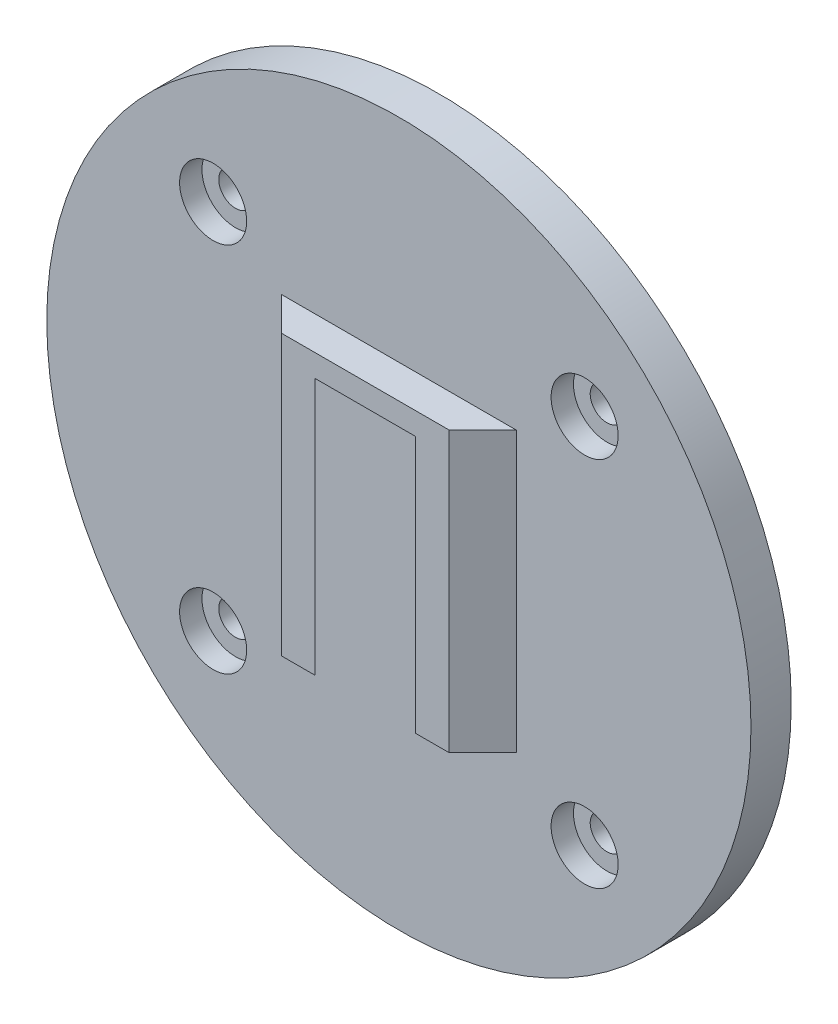
ISO-10303-21;
HEADER;
FILE_DESCRIPTION(('STEP AP214'),'2;1');
FILE_NAME('part.step','',(''),(''),'','','');
FILE_SCHEMA(('AUTOMOTIVE_DESIGN { 1 0 10303 214 1 1 1 1 }'));
ENDSEC;
DATA;
#1=APPLICATION_CONTEXT('core data for automotive mechanical design processes');
#2=APPLICATION_PROTOCOL_DEFINITION('international standard','automotive_design',2000,#1);
#3=PRODUCT_CONTEXT('',#1,'mechanical');
#4=PRODUCT('Part','Part','',(#3));
#5=PRODUCT_RELATED_PRODUCT_CATEGORY('part','',(#4));
#6=PRODUCT_DEFINITION_FORMATION('','',#4);
#7=PRODUCT_DEFINITION_CONTEXT('part definition',#1,'design');
#8=PRODUCT_DEFINITION('design','',#6,#7);
#9=PRODUCT_DEFINITION_SHAPE('','',#8);
#10=(LENGTH_UNIT() NAMED_UNIT(*) SI_UNIT(.MILLI.,.METRE.));
#11=(NAMED_UNIT(*) PLANE_ANGLE_UNIT() SI_UNIT($,.RADIAN.));
#12=(NAMED_UNIT(*) SI_UNIT($,.STERADIAN.) SOLID_ANGLE_UNIT());
#13=UNCERTAINTY_MEASURE_WITH_UNIT(LENGTH_MEASURE(1.E-05),#10,'distance_accuracy_value','');
#14=(GEOMETRIC_REPRESENTATION_CONTEXT(3) GLOBAL_UNCERTAINTY_ASSIGNED_CONTEXT((#13)) GLOBAL_UNIT_ASSIGNED_CONTEXT((#10,
#11,#12)) REPRESENTATION_CONTEXT('',''));
#15=CARTESIAN_POINT('',(0.,0.,0.));
#16=DIRECTION('',(0.,0.,1.));
#17=DIRECTION('',(1.,0.,0.));
#18=AXIS2_PLACEMENT_3D('',#15,#16,#17);
#19=CARTESIAN_POINT('',(-83.1652705934702,-1.17657342657344,6.6));
#20=DIRECTION('',(0.,1.,0.));
#21=DIRECTION('',(0.,0.,1.));
#22=AXIS2_PLACEMENT_3D('',#19,#20,#21);
#23=PLANE('',#22);
#24=DIRECTION('',(1.,0.,0.));
#25=VECTOR('',#24,1.);
#26=CARTESIAN_POINT('',(-83.1652705934702,-1.17657342657344,3.6));
#27=LINE('',#26,#25);
#28=CARTESIAN_POINT('',(-86.1652705934701,-1.17657342657344,3.6));
#29=VERTEX_POINT('',#28);
#30=CARTESIAN_POINT('',(-83.1652705934702,-1.17657342657344,3.6));
#31=VERTEX_POINT('',#30);
#32=EDGE_CURVE('E152',#29,#31,#27,.T.);
#33=ORIENTED_EDGE('',*,*,#32,.T.);
#34=DIRECTION('',(-0.707106781186546,0.,-0.707106781186549));
#35=VECTOR('',#34,1.);
#36=CARTESIAN_POINT('',(-83.1652705934702,-1.17657342657344,3.6));
#37=LINE('',#36,#35);
#38=CARTESIAN_POINT('',(-80.1652705934702,-1.17657342657344,6.6));
#39=VERTEX_POINT('',#38);
#40=EDGE_CURVE('E120',#39,#31,#37,.T.);
#41=ORIENTED_EDGE('',*,*,#40,.F.);
#42=DIRECTION('',(1.,0.,0.));
#43=VECTOR('',#42,1.);
#44=CARTESIAN_POINT('',(-83.1652705934702,-1.17657342657344,6.6));
#45=LINE('',#44,#43);
#46=CARTESIAN_POINT('',(-83.1652705934702,-1.17657342657344,6.6));
#47=VERTEX_POINT('',#46);
#48=EDGE_CURVE('E158',#47,#39,#45,.T.);
#49=ORIENTED_EDGE('',*,*,#48,.F.);
#50=DIRECTION('',(-0.707106781186541,0.,-0.707106781186554));
#51=VECTOR('',#50,1.);
#52=CARTESIAN_POINT('',(-83.1652705934702,-1.17657342657344,6.6));
#53=LINE('',#52,#51);
#54=EDGE_CURVE('E58',#47,#29,#53,.T.);
#55=ORIENTED_EDGE('',*,*,#54,.T.);
#56=EDGE_LOOP('',(#33,#41,#49,#55));
#57=FACE_BOUND('',#56,.T.);
#58=ADVANCED_FACE('F33',(#57),#23,.F.);
#59=CARTESIAN_POINT('',(-75.6652705934702,11.3234265734266,3.6));
#60=DIRECTION('',(0.,0.,1.));
#61=DIRECTION('',(1.,0.,0.));
#62=AXIS2_PLACEMENT_3D('',#59,#60,#61);
#63=PLANE('',#62);
#64=CARTESIAN_POINT('',(-92.282279951354,-5.29358278445712,3.6));
#65=DIRECTION('',(0.,0.,1.));
#66=DIRECTION('',(1.,0.,0.));
#67=AXIS2_PLACEMENT_3D('',#64,#65,#66);
#68=CIRCLE('',#67,3.00000000000001);
#69=CARTESIAN_POINT('',(-89.282279951354,-5.29358278445712,3.6));
#70=VERTEX_POINT('',#69);
#71=EDGE_CURVE('E161',#70,#70,#68,.T.);
#72=ORIENTED_EDGE('',*,*,#71,.F.);
#73=EDGE_LOOP('',(#72));
#74=FACE_BOUND('',#73,.T.);
#75=CARTESIAN_POINT('',(-59.0482612355863,-5.2935827844571,3.6));
#76=DIRECTION('',(0.,0.,1.));
#77=DIRECTION('',(1.,0.,0.));
#78=AXIS2_PLACEMENT_3D('',#75,#76,#77);
#79=CIRCLE('',#78,3.);
#80=CARTESIAN_POINT('',(-56.0482612355863,-5.2935827844571,3.6));
#81=VERTEX_POINT('',#80);
#82=EDGE_CURVE('E175',#81,#81,#79,.T.);
#83=ORIENTED_EDGE('',*,*,#82,.F.);
#84=EDGE_LOOP('',(#83));
#85=FACE_BOUND('',#84,.T.);
#86=CARTESIAN_POINT('',(-59.0482612355863,27.9404359313105,3.6));
#87=DIRECTION('',(0.,0.,1.));
#88=DIRECTION('',(1.,0.,0.));
#89=AXIS2_PLACEMENT_3D('',#86,#87,#88);
#90=CIRCLE('',#89,3.);
#91=CARTESIAN_POINT('',(-56.0482612355863,27.9404359313105,3.6));
#92=VERTEX_POINT('',#91);
#93=EDGE_CURVE('E169',#92,#92,#90,.T.);
#94=ORIENTED_EDGE('',*,*,#93,.F.);
#95=EDGE_LOOP('',(#94));
#96=FACE_BOUND('',#95,.T.);
#97=CARTESIAN_POINT('',(-92.282279951354,27.9404359313105,3.6));
#98=DIRECTION('',(0.,0.,1.));
#99=DIRECTION('',(1.,0.,0.));
#100=AXIS2_PLACEMENT_3D('',#97,#98,#99);
#101=CIRCLE('',#100,3.00000000000001);
#102=CARTESIAN_POINT('',(-89.282279951354,27.9404359313105,3.6));
#103=VERTEX_POINT('',#102);
#104=EDGE_CURVE('E168',#103,#103,#101,.T.);
#105=ORIENTED_EDGE('',*,*,#104,.F.);
#106=EDGE_LOOP('',(#105));
#107=FACE_BOUND('',#106,.T.);
#108=CARTESIAN_POINT('',(-75.6652705934702,11.3234265734266,3.6));
#109=DIRECTION('',(0.,0.,1.));
#110=DIRECTION('',(1.,0.,0.));
#111=AXIS2_PLACEMENT_3D('',#108,#109,#110);
#112=CIRCLE('',#111,31.5);
#113=CARTESIAN_POINT('',(-44.1652705934702,11.3234265734266,3.6));
#114=VERTEX_POINT('',#113);
#115=EDGE_CURVE('E11',#114,#114,#112,.T.);
#116=ORIENTED_EDGE('',*,*,#115,.T.);
#117=EDGE_LOOP('',(#116));
#118=FACE_BOUND('',#117,.T.);
#119=DIRECTION('',(-1.,0.,0.));
#120=VECTOR('',#119,1.);
#121=CARTESIAN_POINT('',(-83.1652705934702,23.8234265734266,3.6));
#122=LINE('',#121,#120);
#123=CARTESIAN_POINT('',(-65.1652705934701,23.8234265734266,3.6));
#124=VERTEX_POINT('',#123);
#125=CARTESIAN_POINT('',(-86.1652705934701,23.8234265734266,3.6));
#126=VERTEX_POINT('',#125);
#127=EDGE_CURVE('E147',#124,#126,#122,.T.);
#128=ORIENTED_EDGE('',*,*,#127,.F.);
#129=DIRECTION('',(0.,-1.,0.));
#130=VECTOR('',#129,1.);
#131=CARTESIAN_POINT('',(-65.1652705934701,23.8234265734266,3.6));
#132=LINE('',#131,#130);
#133=CARTESIAN_POINT('',(-65.1652705934701,-1.17657342657344,3.6));
#134=VERTEX_POINT('',#133);
#135=EDGE_CURVE('E137',#124,#134,#132,.T.);
#136=ORIENTED_EDGE('',*,*,#135,.T.);
#137=CARTESIAN_POINT('',(-68.1652705934701,-1.17657342657344,3.6));
#138=VERTEX_POINT('',#137);
#139=EDGE_CURVE('E107',#138,#134,#27,.T.);
#140=ORIENTED_EDGE('',*,*,#139,.F.);
#141=DIRECTION('',(0.,-1.,0.));
#142=VECTOR('',#141,1.);
#143=CARTESIAN_POINT('',(-68.1652705934701,21.8234265734266,3.6));
#144=LINE('',#143,#142);
#145=CARTESIAN_POINT('',(-68.1652705934701,21.8234265734266,3.6));
#146=VERTEX_POINT('',#145);
#147=EDGE_CURVE('E102',#146,#138,#144,.T.);
#148=ORIENTED_EDGE('',*,*,#147,.F.);
#149=DIRECTION('',(1.,0.,0.));
#150=VECTOR('',#149,1.);
#151=CARTESIAN_POINT('',(-83.1652705934702,21.8234265734266,3.6));
#152=LINE('',#151,#150);
#153=CARTESIAN_POINT('',(-83.1652705934702,21.8234265734266,3.6));
#154=VERTEX_POINT('',#153);
#155=EDGE_CURVE('E104',#154,#146,#152,.T.);
#156=ORIENTED_EDGE('',*,*,#155,.F.);
#157=DIRECTION('',(0.,-1.,0.));
#158=VECTOR('',#157,1.);
#159=CARTESIAN_POINT('',(-83.1652705934702,21.8234265734266,3.6));
#160=LINE('',#159,#158);
#161=EDGE_CURVE('E129',#154,#31,#160,.T.);
#162=ORIENTED_EDGE('',*,*,#161,.T.);
#163=ORIENTED_EDGE('',*,*,#32,.F.);
#164=DIRECTION('',(0.,-1.,0.));
#165=VECTOR('',#164,1.);
#166=CARTESIAN_POINT('',(-86.1652705934701,23.8234265734266,3.6));
#167=LINE('',#166,#165);
#168=EDGE_CURVE('E144',#126,#29,#167,.T.);
#169=ORIENTED_EDGE('',*,*,#168,.F.);
#170=EDGE_LOOP('',(#128,#136,#140,#148,#156,#162,#163,#169));
#171=FACE_BOUND('',#170,.T.);
#172=ADVANCED_FACE('F103',(#74,#85,#96,#107,#118,#171),#63,.T.);
#173=CARTESIAN_POINT('',(-92.282279951354,27.9404359313105,0.));
#174=DIRECTION('',(0.,0.,1.));
#175=DIRECTION('',(1.,0.,0.));
#176=AXIS2_PLACEMENT_3D('',#173,#174,#175);
#177=CYLINDRICAL_SURFACE('',#176,1.5);
#178=CARTESIAN_POINT('',(-92.282279951354,27.9404359313105,0.));
#179=DIRECTION('',(0.,0.,1.));
#180=DIRECTION('',(1.,0.,0.));
#181=AXIS2_PLACEMENT_3D('',#178,#179,#180);
#182=CIRCLE('',#181,1.5);
#183=CARTESIAN_POINT('',(-90.782279951354,27.9404359313105,0.));
#184=VERTEX_POINT('',#183);
#185=EDGE_CURVE('E192',#184,#184,#182,.T.);
#186=ORIENTED_EDGE('',*,*,#185,.F.);
#187=EDGE_LOOP('',(#186));
#188=FACE_BOUND('',#187,.T.);
#189=CARTESIAN_POINT('',(-92.282279951354,27.9404359313105,1.6));
#190=DIRECTION('',(0.,0.,1.));
#191=DIRECTION('',(1.,0.,0.));
#192=AXIS2_PLACEMENT_3D('',#189,#190,#191);
#193=CIRCLE('',#192,1.5);
#194=CARTESIAN_POINT('',(-90.782279951354,27.9404359313105,1.6));
#195=VERTEX_POINT('',#194);
#196=EDGE_CURVE('E37',#195,#195,#193,.F.);
#197=ORIENTED_EDGE('',*,*,#196,.F.);
#198=EDGE_LOOP('',(#197));
#199=FACE_BOUND('',#198,.T.);
#200=ADVANCED_FACE('F216',(#188,#199),#177,.F.);
#201=CARTESIAN_POINT('',(-59.0482612355863,27.9404359313105,0.));
#202=DIRECTION('',(0.,0.,1.));
#203=DIRECTION('',(1.,0.,0.));
#204=AXIS2_PLACEMENT_3D('',#201,#202,#203);
#205=CYLINDRICAL_SURFACE('',#204,1.5);
#206=CARTESIAN_POINT('',(-59.0482612355863,27.9404359313105,0.));
#207=DIRECTION('',(0.,0.,1.));
#208=DIRECTION('',(1.,0.,0.));
#209=AXIS2_PLACEMENT_3D('',#206,#207,#208);
#210=CIRCLE('',#209,1.5);
#211=CARTESIAN_POINT('',(-57.5482612355863,27.9404359313105,0.));
#212=VERTEX_POINT('',#211);
#213=EDGE_CURVE('E189',#212,#212,#210,.T.);
#214=ORIENTED_EDGE('',*,*,#213,.F.);
#215=EDGE_LOOP('',(#214));
#216=FACE_BOUND('',#215,.T.);
#217=CARTESIAN_POINT('',(-59.0482612355863,27.9404359313105,1.6));
#218=DIRECTION('',(0.,0.,1.));
#219=DIRECTION('',(1.,0.,0.));
#220=AXIS2_PLACEMENT_3D('',#217,#218,#219);
#221=CIRCLE('',#220,1.5);
#222=CARTESIAN_POINT('',(-57.5482612355863,27.9404359313105,1.6));
#223=VERTEX_POINT('',#222);
#224=EDGE_CURVE('E207',#223,#223,#221,.F.);
#225=ORIENTED_EDGE('',*,*,#224,.F.);
#226=EDGE_LOOP('',(#225));
#227=FACE_BOUND('',#226,.T.);
#228=ADVANCED_FACE('F218',(#216,#227),#205,.F.);
#229=CARTESIAN_POINT('',(-59.0482612355863,-5.2935827844571,0.));
#230=DIRECTION('',(0.,0.,1.));
#231=DIRECTION('',(1.,0.,0.));
#232=AXIS2_PLACEMENT_3D('',#229,#230,#231);
#233=CYLINDRICAL_SURFACE('',#232,1.5);
#234=CARTESIAN_POINT('',(-59.0482612355863,-5.2935827844571,0.));
#235=DIRECTION('',(0.,0.,1.));
#236=DIRECTION('',(1.,0.,0.));
#237=AXIS2_PLACEMENT_3D('',#234,#235,#236);
#238=CIRCLE('',#237,1.5);
#239=CARTESIAN_POINT('',(-57.5482612355863,-5.2935827844571,0.));
#240=VERTEX_POINT('',#239);
#241=EDGE_CURVE('E193',#240,#240,#238,.T.);
#242=ORIENTED_EDGE('',*,*,#241,.F.);
#243=EDGE_LOOP('',(#242));
#244=FACE_BOUND('',#243,.T.);
#245=CARTESIAN_POINT('',(-59.0482612355863,-5.2935827844571,1.6));
#246=DIRECTION('',(0.,0.,1.));
#247=DIRECTION('',(1.,0.,0.));
#248=AXIS2_PLACEMENT_3D('',#245,#246,#247);
#249=CIRCLE('',#248,1.5);
#250=CARTESIAN_POINT('',(-57.5482612355863,-5.2935827844571,1.6));
#251=VERTEX_POINT('',#250);
#252=EDGE_CURVE('E205',#251,#251,#249,.F.);
#253=ORIENTED_EDGE('',*,*,#252,.F.);
#254=EDGE_LOOP('',(#253));
#255=FACE_BOUND('',#254,.T.);
#256=ADVANCED_FACE('F225',(#244,#255),#233,.F.);
#257=CARTESIAN_POINT('',(-92.282279951354,-5.29358278445712,0.));
#258=DIRECTION('',(0.,0.,1.));
#259=DIRECTION('',(1.,0.,0.));
#260=AXIS2_PLACEMENT_3D('',#257,#258,#259);
#261=CYLINDRICAL_SURFACE('',#260,1.5);
#262=CARTESIAN_POINT('',(-92.282279951354,-5.29358278445712,0.));
#263=DIRECTION('',(0.,0.,1.));
#264=DIRECTION('',(1.,0.,0.));
#265=AXIS2_PLACEMENT_3D('',#262,#263,#264);
#266=CIRCLE('',#265,1.5);
#267=CARTESIAN_POINT('',(-90.782279951354,-5.29358278445712,0.));
#268=VERTEX_POINT('',#267);
#269=EDGE_CURVE('E196',#268,#268,#266,.T.);
#270=ORIENTED_EDGE('',*,*,#269,.F.);
#271=EDGE_LOOP('',(#270));
#272=FACE_BOUND('',#271,.T.);
#273=CARTESIAN_POINT('',(-92.282279951354,-5.29358278445712,1.6));
#274=DIRECTION('',(0.,0.,1.));
#275=DIRECTION('',(1.,0.,0.));
#276=AXIS2_PLACEMENT_3D('',#273,#274,#275);
#277=CIRCLE('',#276,1.5);
#278=CARTESIAN_POINT('',(-90.782279951354,-5.29358278445712,1.6));
#279=VERTEX_POINT('',#278);
#280=EDGE_CURVE('E186',#279,#279,#277,.F.);
#281=ORIENTED_EDGE('',*,*,#280,.F.);
#282=EDGE_LOOP('',(#281));
#283=FACE_BOUND('',#282,.T.);
#284=ADVANCED_FACE('F424',(#272,#283),#261,.F.);
#285=CARTESIAN_POINT('',(-75.6652705934702,11.3234265734266,3.6));
#286=DIRECTION('',(0.,0.,-1.));
#287=DIRECTION('',(-1.,0.,0.));
#288=AXIS2_PLACEMENT_3D('',#285,#286,#287);
#289=CYLINDRICAL_SURFACE('',#288,31.5);
#290=ORIENTED_EDGE('',*,*,#115,.F.);
#291=EDGE_LOOP('',(#290));
#292=FACE_BOUND('',#291,.T.);
#293=CARTESIAN_POINT('',(-75.6652705934702,11.3234265734266,0.));
#294=DIRECTION('',(0.,0.,1.));
#295=DIRECTION('',(1.,0.,0.));
#296=AXIS2_PLACEMENT_3D('',#293,#294,#295);
#297=CIRCLE('',#296,31.5);
#298=CARTESIAN_POINT('',(-44.1652705934702,11.3234265734266,0.));
#299=VERTEX_POINT('',#298);
#300=EDGE_CURVE('E42',#299,#299,#297,.T.);
#301=ORIENTED_EDGE('',*,*,#300,.T.);
#302=EDGE_LOOP('',(#301));
#303=FACE_BOUND('',#302,.T.);
#304=ADVANCED_FACE('F35',(#292,#303),#289,.T.);
#305=CARTESIAN_POINT('',(-75.6652705934702,11.3234265734266,0.));
#306=DIRECTION('',(0.,0.,1.));
#307=DIRECTION('',(1.,0.,0.));
#308=AXIS2_PLACEMENT_3D('',#305,#306,#307);
#309=PLANE('',#308);
#310=ORIENTED_EDGE('',*,*,#269,.T.);
#311=EDGE_LOOP('',(#310));
#312=FACE_BOUND('',#311,.T.);
#313=ORIENTED_EDGE('',*,*,#241,.T.);
#314=EDGE_LOOP('',(#313));
#315=FACE_BOUND('',#314,.T.);
#316=ORIENTED_EDGE('',*,*,#213,.T.);
#317=EDGE_LOOP('',(#316));
#318=FACE_BOUND('',#317,.T.);
#319=ORIENTED_EDGE('',*,*,#185,.T.);
#320=EDGE_LOOP('',(#319));
#321=FACE_BOUND('',#320,.T.);
#322=ORIENTED_EDGE('',*,*,#300,.F.);
#323=EDGE_LOOP('',(#322));
#324=FACE_BOUND('',#323,.T.);
#325=ADVANCED_FACE('F416',(#312,#315,#318,#321,#324),#309,.F.);
#326=CARTESIAN_POINT('',(-92.282279951354,-5.29358278445712,1.6));
#327=DIRECTION('',(0.,0.,1.));
#328=DIRECTION('',(1.,0.,0.));
#329=AXIS2_PLACEMENT_3D('',#326,#327,#328);
#330=PLANE('',#329);
#331=CARTESIAN_POINT('',(-92.282279951354,-5.29358278445712,1.6));
#332=DIRECTION('',(0.,0.,1.));
#333=DIRECTION('',(1.,0.,0.));
#334=AXIS2_PLACEMENT_3D('',#331,#332,#333);
#335=CIRCLE('',#334,3.00000000000001);
#336=CARTESIAN_POINT('',(-89.282279951354,-5.29358278445712,1.6));
#337=VERTEX_POINT('',#336);
#338=EDGE_CURVE('E178',#337,#337,#335,.T.);
#339=ORIENTED_EDGE('',*,*,#338,.T.);
#340=EDGE_LOOP('',(#339));
#341=FACE_BOUND('',#340,.T.);
#342=ORIENTED_EDGE('',*,*,#280,.T.);
#343=EDGE_LOOP('',(#342));
#344=FACE_BOUND('',#343,.T.);
#345=ADVANCED_FACE('F406',(#341,#344),#330,.T.);
#346=CARTESIAN_POINT('',(-92.282279951354,-5.29358278445712,1.6));
#347=DIRECTION('',(0.,0.,1.));
#348=DIRECTION('',(1.,0.,0.));
#349=AXIS2_PLACEMENT_3D('',#346,#347,#348);
#350=CYLINDRICAL_SURFACE('',#349,3.00000000000001);
#351=ORIENTED_EDGE('',*,*,#338,.F.);
#352=EDGE_LOOP('',(#351));
#353=FACE_BOUND('',#352,.T.);
#354=ORIENTED_EDGE('',*,*,#71,.T.);
#355=EDGE_LOOP('',(#354));
#356=FACE_BOUND('',#355,.T.);
#357=ADVANCED_FACE('F396',(#353,#356),#350,.F.);
#358=CARTESIAN_POINT('',(-59.0482612355863,-5.2935827844571,1.6));
#359=DIRECTION('',(0.,0.,1.));
#360=DIRECTION('',(1.,0.,0.));
#361=AXIS2_PLACEMENT_3D('',#358,#359,#360);
#362=PLANE('',#361);
#363=CARTESIAN_POINT('',(-59.0482612355863,-5.2935827844571,1.6));
#364=DIRECTION('',(0.,0.,1.));
#365=DIRECTION('',(1.,0.,0.));
#366=AXIS2_PLACEMENT_3D('',#363,#364,#365);
#367=CIRCLE('',#366,3.);
#368=CARTESIAN_POINT('',(-56.0482612355863,-5.2935827844571,1.6));
#369=VERTEX_POINT('',#368);
#370=EDGE_CURVE('E172',#369,#369,#367,.T.);
#371=ORIENTED_EDGE('',*,*,#370,.T.);
#372=EDGE_LOOP('',(#371));
#373=FACE_BOUND('',#372,.T.);
#374=ORIENTED_EDGE('',*,*,#252,.T.);
#375=EDGE_LOOP('',(#374));
#376=FACE_BOUND('',#375,.T.);
#377=ADVANCED_FACE('F386',(#373,#376),#362,.T.);
#378=CARTESIAN_POINT('',(-59.0482612355863,-5.2935827844571,1.6));
#379=DIRECTION('',(0.,0.,1.));
#380=DIRECTION('',(1.,0.,0.));
#381=AXIS2_PLACEMENT_3D('',#378,#379,#380);
#382=CYLINDRICAL_SURFACE('',#381,3.);
#383=ORIENTED_EDGE('',*,*,#370,.F.);
#384=EDGE_LOOP('',(#383));
#385=FACE_BOUND('',#384,.T.);
#386=ORIENTED_EDGE('',*,*,#82,.T.);
#387=EDGE_LOOP('',(#386));
#388=FACE_BOUND('',#387,.T.);
#389=ADVANCED_FACE('F376',(#385,#388),#382,.F.);
#390=CARTESIAN_POINT('',(-59.0482612355863,27.9404359313105,1.6));
#391=DIRECTION('',(0.,0.,1.));
#392=DIRECTION('',(1.,0.,0.));
#393=AXIS2_PLACEMENT_3D('',#390,#391,#392);
#394=PLANE('',#393);
#395=CARTESIAN_POINT('',(-59.0482612355863,27.9404359313105,1.6));
#396=DIRECTION('',(0.,0.,1.));
#397=DIRECTION('',(1.,0.,0.));
#398=AXIS2_PLACEMENT_3D('',#395,#396,#397);
#399=CIRCLE('',#398,3.);
#400=CARTESIAN_POINT('',(-56.0482612355863,27.9404359313105,1.6));
#401=VERTEX_POINT('',#400);
#402=EDGE_CURVE('E165',#401,#401,#399,.T.);
#403=ORIENTED_EDGE('',*,*,#402,.T.);
#404=EDGE_LOOP('',(#403));
#405=FACE_BOUND('',#404,.T.);
#406=ORIENTED_EDGE('',*,*,#224,.T.);
#407=EDGE_LOOP('',(#406));
#408=FACE_BOUND('',#407,.T.);
#409=ADVANCED_FACE('F366',(#405,#408),#394,.T.);
#410=CARTESIAN_POINT('',(-59.0482612355863,27.9404359313105,1.6));
#411=DIRECTION('',(0.,0.,1.));
#412=DIRECTION('',(1.,0.,0.));
#413=AXIS2_PLACEMENT_3D('',#410,#411,#412);
#414=CYLINDRICAL_SURFACE('',#413,3.);
#415=ORIENTED_EDGE('',*,*,#402,.F.);
#416=EDGE_LOOP('',(#415));
#417=FACE_BOUND('',#416,.T.);
#418=ORIENTED_EDGE('',*,*,#93,.T.);
#419=EDGE_LOOP('',(#418));
#420=FACE_BOUND('',#419,.T.);
#421=ADVANCED_FACE('F356',(#417,#420),#414,.F.);
#422=CARTESIAN_POINT('',(-92.282279951354,27.9404359313105,1.6));
#423=DIRECTION('',(0.,0.,1.));
#424=DIRECTION('',(1.,0.,0.));
#425=AXIS2_PLACEMENT_3D('',#422,#423,#424);
#426=PLANE('',#425);
#427=CARTESIAN_POINT('',(-92.282279951354,27.9404359313105,1.6));
#428=DIRECTION('',(0.,0.,1.));
#429=DIRECTION('',(1.,0.,0.));
#430=AXIS2_PLACEMENT_3D('',#427,#428,#429);
#431=CIRCLE('',#430,3.00000000000001);
#432=CARTESIAN_POINT('',(-89.282279951354,27.9404359313105,1.6));
#433=VERTEX_POINT('',#432);
#434=EDGE_CURVE('E183',#433,#433,#431,.T.);
#435=ORIENTED_EDGE('',*,*,#434,.T.);
#436=EDGE_LOOP('',(#435));
#437=FACE_BOUND('',#436,.T.);
#438=ORIENTED_EDGE('',*,*,#196,.T.);
#439=EDGE_LOOP('',(#438));
#440=FACE_BOUND('',#439,.T.);
#441=ADVANCED_FACE('F214',(#437,#440),#426,.T.);
#442=CARTESIAN_POINT('',(-92.282279951354,27.9404359313105,1.6));
#443=DIRECTION('',(0.,0.,1.));
#444=DIRECTION('',(1.,0.,0.));
#445=AXIS2_PLACEMENT_3D('',#442,#443,#444);
#446=CYLINDRICAL_SURFACE('',#445,3.00000000000001);
#447=ORIENTED_EDGE('',*,*,#434,.F.);
#448=EDGE_LOOP('',(#447));
#449=FACE_BOUND('',#448,.T.);
#450=ORIENTED_EDGE('',*,*,#104,.T.);
#451=EDGE_LOOP('',(#450));
#452=FACE_BOUND('',#451,.T.);
#453=ADVANCED_FACE('F250',(#449,#452),#446,.F.);
#454=CARTESIAN_POINT('',(-83.1652705934702,23.8234265734266,6.6));
#455=DIRECTION('',(0.,-1.,0.));
#456=DIRECTION('',(0.,0.,-1.));
#457=AXIS2_PLACEMENT_3D('',#454,#455,#456);
#458=PLANE('',#457);
#459=ORIENTED_EDGE('',*,*,#127,.T.);
#460=DIRECTION('',(-0.707106781186541,0.,-0.707106781186554));
#461=VECTOR('',#460,1.);
#462=CARTESIAN_POINT('',(-83.1652705934702,23.8234265734266,6.6));
#463=LINE('',#462,#461);
#464=CARTESIAN_POINT('',(-83.1652705934702,23.8234265734266,6.6));
#465=VERTEX_POINT('',#464);
#466=EDGE_CURVE('E141',#465,#126,#463,.T.);
#467=ORIENTED_EDGE('',*,*,#466,.F.);
#468=DIRECTION('',(-1.,0.,0.));
#469=VECTOR('',#468,1.);
#470=CARTESIAN_POINT('',(-83.1652705934702,23.8234265734266,6.6));
#471=LINE('',#470,#469);
#472=CARTESIAN_POINT('',(-68.1652705934702,23.8234265734266,6.6));
#473=VERTEX_POINT('',#472);
#474=EDGE_CURVE('E151',#473,#465,#471,.T.);
#475=ORIENTED_EDGE('',*,*,#474,.F.);
#476=DIRECTION('',(-0.707106781186554,0.,0.707106781186541));
#477=VECTOR('',#476,1.);
#478=CARTESIAN_POINT('',(-68.1652705934702,23.8234265734266,6.6));
#479=LINE('',#478,#477);
#480=EDGE_CURVE('E135',#124,#473,#479,.T.);
#481=ORIENTED_EDGE('',*,*,#480,.F.);
#482=EDGE_LOOP('',(#459,#467,#475,#481));
#483=FACE_BOUND('',#482,.T.);
#484=ADVANCED_FACE('F242',(#483),#458,.F.);
#485=CARTESIAN_POINT('',(-71.1652705934702,-1.17657342657344,6.6));
#486=VERTEX_POINT('',#485);
#487=CARTESIAN_POINT('',(-68.1652705934702,-1.17657342657344,6.6));
#488=VERTEX_POINT('',#487);
#489=EDGE_CURVE('E157',#486,#488,#45,.T.);
#490=ORIENTED_EDGE('',*,*,#489,.F.);
#491=DIRECTION('',(-0.707106781186551,0.,0.707106781186544));
#492=VECTOR('',#491,1.);
#493=CARTESIAN_POINT('',(-68.1652705934701,-1.17657342657344,3.6));
#494=LINE('',#493,#492);
#495=EDGE_CURVE('E123',#138,#486,#494,.T.);
#496=ORIENTED_EDGE('',*,*,#495,.F.);
#497=ORIENTED_EDGE('',*,*,#139,.T.);
#498=DIRECTION('',(-0.707106781186554,0.,0.707106781186541));
#499=VECTOR('',#498,1.);
#500=CARTESIAN_POINT('',(-68.1652705934702,-1.17657342657344,6.6));
#501=LINE('',#500,#499);
#502=EDGE_CURVE('E131',#134,#488,#501,.T.);
#503=ORIENTED_EDGE('',*,*,#502,.T.);
#504=EDGE_LOOP('',(#490,#496,#497,#503));
#505=FACE_BOUND('',#504,.T.);
#506=ADVANCED_FACE('F235',(#505),#23,.F.);
#507=CARTESIAN_POINT('',(0.,0.,6.6));
#508=DIRECTION('',(0.,0.,-1.));
#509=DIRECTION('',(-1.,0.,0.));
#510=AXIS2_PLACEMENT_3D('',#507,#508,#509);
#511=PLANE('',#510);
#512=ORIENTED_EDGE('',*,*,#48,.T.);
#513=DIRECTION('',(0.,-1.,0.));
#514=VECTOR('',#513,1.);
#515=CARTESIAN_POINT('',(-80.1652705934702,21.8234265734266,6.6));
#516=LINE('',#515,#514);
#517=CARTESIAN_POINT('',(-80.1652705934702,21.8234265734266,6.6));
#518=VERTEX_POINT('',#517);
#519=EDGE_CURVE('E132',#518,#39,#516,.T.);
#520=ORIENTED_EDGE('',*,*,#519,.F.);
#521=DIRECTION('',(-1.,0.,0.));
#522=VECTOR('',#521,1.);
#523=CARTESIAN_POINT('',(-71.1652705934702,21.8234265734266,6.6));
#524=LINE('',#523,#522);
#525=CARTESIAN_POINT('',(-71.1652705934702,21.8234265734266,6.6));
#526=VERTEX_POINT('',#525);
#527=EDGE_CURVE('E116',#526,#518,#524,.T.);
#528=ORIENTED_EDGE('',*,*,#527,.F.);
#529=DIRECTION('',(0.,-1.,0.));
#530=VECTOR('',#529,1.);
#531=CARTESIAN_POINT('',(-71.1652705934702,21.8234265734266,6.6));
#532=LINE('',#531,#530);
#533=EDGE_CURVE('E110',#526,#486,#532,.T.);
#534=ORIENTED_EDGE('',*,*,#533,.T.);
#535=ORIENTED_EDGE('',*,*,#489,.T.);
#536=DIRECTION('',(0.,1.,0.));
#537=VECTOR('',#536,1.);
#538=CARTESIAN_POINT('',(-68.1652705934702,-1.17657342657344,6.6));
#539=LINE('',#538,#537);
#540=EDGE_CURVE('E148',#488,#473,#539,.T.);
#541=ORIENTED_EDGE('',*,*,#540,.T.);
#542=ORIENTED_EDGE('',*,*,#474,.T.);
#543=DIRECTION('',(0.,-1.,0.));
#544=VECTOR('',#543,1.);
#545=CARTESIAN_POINT('',(-83.1652705934702,-1.17657342657344,6.6));
#546=LINE('',#545,#544);
#547=EDGE_CURVE('E155',#465,#47,#546,.T.);
#548=ORIENTED_EDGE('',*,*,#547,.T.);
#549=EDGE_LOOP('',(#512,#520,#528,#534,#535,#541,#542,#548));
#550=FACE_BOUND('',#549,.T.);
#551=ADVANCED_FACE('F241',(#550),#511,.F.);
#552=CARTESIAN_POINT('',(-83.1652705934702,23.8234265734266,6.6));
#553=DIRECTION('',(-0.707106781186554,0.,0.707106781186541));
#554=DIRECTION('',(0.707106781186541,0.,0.707106781186554));
#555=AXIS2_PLACEMENT_3D('',#552,#553,#554);
#556=PLANE('',#555);
#557=ORIENTED_EDGE('',*,*,#54,.F.);
#558=ORIENTED_EDGE('',*,*,#547,.F.);
#559=ORIENTED_EDGE('',*,*,#466,.T.);
#560=ORIENTED_EDGE('',*,*,#168,.T.);
#561=EDGE_LOOP('',(#557,#558,#559,#560));
#562=FACE_BOUND('',#561,.T.);
#563=ADVANCED_FACE('F248',(#562),#556,.T.);
#564=CARTESIAN_POINT('',(-68.1652705934702,23.8234265734266,6.6));
#565=DIRECTION('',(0.707106781186541,0.,0.707106781186554));
#566=DIRECTION('',(0.707106781186554,0.,-0.707106781186541));
#567=AXIS2_PLACEMENT_3D('',#564,#565,#566);
#568=PLANE('',#567);
#569=ORIENTED_EDGE('',*,*,#502,.F.);
#570=ORIENTED_EDGE('',*,*,#135,.F.);
#571=ORIENTED_EDGE('',*,*,#480,.T.);
#572=ORIENTED_EDGE('',*,*,#540,.F.);
#573=EDGE_LOOP('',(#569,#570,#571,#572));
#574=FACE_BOUND('',#573,.T.);
#575=ADVANCED_FACE('F256',(#574),#568,.T.);
#576=CARTESIAN_POINT('',(-83.1652705934702,21.8234265734266,3.6));
#577=DIRECTION('',(-0.707106781186549,0.,0.707106781186546));
#578=DIRECTION('',(0.707106781186546,0.,0.707106781186549));
#579=AXIS2_PLACEMENT_3D('',#576,#577,#578);
#580=PLANE('',#579);
#581=ORIENTED_EDGE('',*,*,#40,.T.);
#582=ORIENTED_EDGE('',*,*,#161,.F.);
#583=DIRECTION('',(-0.707106781186546,0.,-0.707106781186549));
#584=VECTOR('',#583,1.);
#585=CARTESIAN_POINT('',(-83.1652705934702,21.8234265734266,3.6));
#586=LINE('',#585,#584);
#587=EDGE_CURVE('E111',#518,#154,#586,.T.);
#588=ORIENTED_EDGE('',*,*,#587,.F.);
#589=ORIENTED_EDGE('',*,*,#519,.T.);
#590=EDGE_LOOP('',(#581,#582,#588,#589));
#591=FACE_BOUND('',#590,.T.);
#592=ADVANCED_FACE('F265',(#591),#580,.F.);
#593=CARTESIAN_POINT('',(-68.1652705934701,21.8234265734266,3.6));
#594=DIRECTION('',(0.707106781186544,0.,0.707106781186551));
#595=DIRECTION('',(0.707106781186551,0.,-0.707106781186544));
#596=AXIS2_PLACEMENT_3D('',#593,#594,#595);
#597=PLANE('',#596);
#598=ORIENTED_EDGE('',*,*,#495,.T.);
#599=ORIENTED_EDGE('',*,*,#533,.F.);
#600=DIRECTION('',(-0.707106781186551,0.,0.707106781186544));
#601=VECTOR('',#600,1.);
#602=CARTESIAN_POINT('',(-68.1652705934701,21.8234265734266,3.6));
#603=LINE('',#602,#601);
#604=EDGE_CURVE('E50',#146,#526,#603,.T.);
#605=ORIENTED_EDGE('',*,*,#604,.F.);
#606=ORIENTED_EDGE('',*,*,#147,.T.);
#607=EDGE_LOOP('',(#598,#599,#605,#606));
#608=FACE_BOUND('',#607,.T.);
#609=ADVANCED_FACE('F113',(#608),#597,.F.);
#610=CARTESIAN_POINT('',(0.,21.8234265734266,0.));
#611=DIRECTION('',(0.,-1.,0.));
#612=DIRECTION('',(0.,0.,-1.));
#613=AXIS2_PLACEMENT_3D('',#610,#611,#612);
#614=PLANE('',#613);
#615=ORIENTED_EDGE('',*,*,#155,.T.);
#616=ORIENTED_EDGE('',*,*,#604,.T.);
#617=ORIENTED_EDGE('',*,*,#527,.T.);
#618=ORIENTED_EDGE('',*,*,#587,.T.);
#619=EDGE_LOOP('',(#615,#616,#617,#618));
#620=FACE_BOUND('',#619,.T.);
#621=ADVANCED_FACE('F118',(#620),#614,.T.);
#622=CLOSED_SHELL('',(#58,#172,#200,#228,#256,#284,#304,#325,#345,#357,#377,#389,#409,#421,#441,
#453,#484,#506,#551,#563,#575,#592,#609,#621));
#623=MANIFOLD_SOLID_BREP('B2',#622);
#624=ADVANCED_BREP_SHAPE_REPRESENTATION('',(#18,#623),#14);
#625=SHAPE_DEFINITION_REPRESENTATION(#9,#624);
ENDSEC;
END-ISO-10303-21;
